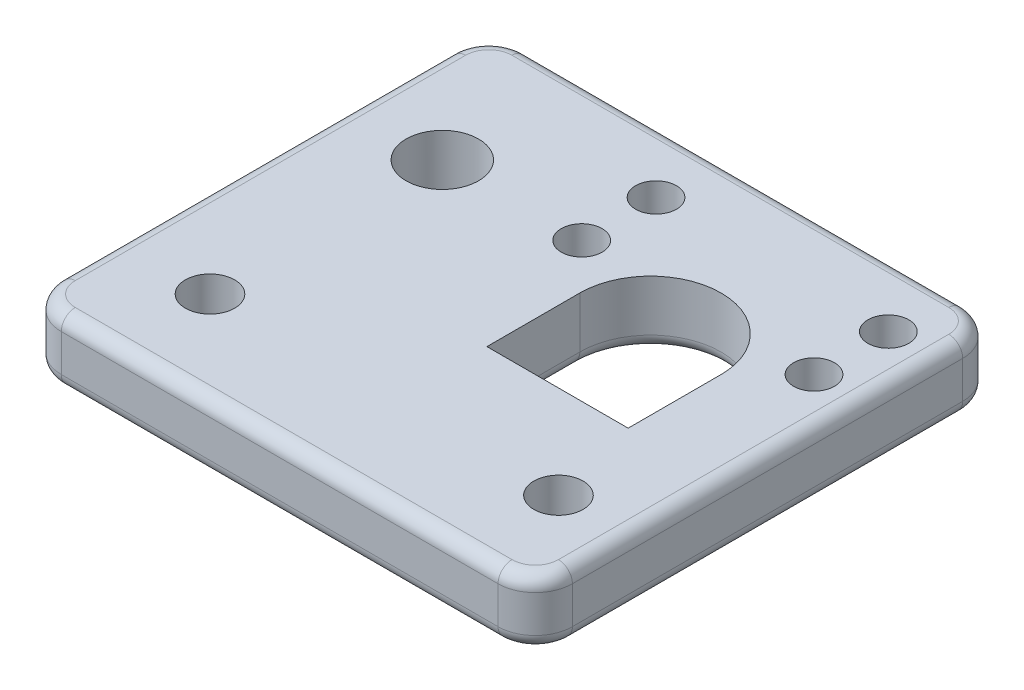
ISO-10303-21;
HEADER;
FILE_DESCRIPTION(('STEP AP214'),'2;1');
FILE_NAME('part.step','',(''),(''),'','','');
FILE_SCHEMA(('AUTOMOTIVE_DESIGN { 1 0 10303 214 1 1 1 1 }'));
ENDSEC;
DATA;
#1=APPLICATION_CONTEXT('core data for automotive mechanical design processes');
#2=APPLICATION_PROTOCOL_DEFINITION('international standard','automotive_design',2000,#1);
#3=PRODUCT_CONTEXT('',#1,'mechanical');
#4=PRODUCT('Part','Part','',(#3));
#5=PRODUCT_RELATED_PRODUCT_CATEGORY('part','',(#4));
#6=PRODUCT_DEFINITION_FORMATION('','',#4);
#7=PRODUCT_DEFINITION_CONTEXT('part definition',#1,'design');
#8=PRODUCT_DEFINITION('design','',#6,#7);
#9=PRODUCT_DEFINITION_SHAPE('','',#8);
#10=(LENGTH_UNIT() NAMED_UNIT(*) SI_UNIT(.MILLI.,.METRE.));
#11=(NAMED_UNIT(*) PLANE_ANGLE_UNIT() SI_UNIT($,.RADIAN.));
#12=(NAMED_UNIT(*) SI_UNIT($,.STERADIAN.) SOLID_ANGLE_UNIT());
#13=UNCERTAINTY_MEASURE_WITH_UNIT(LENGTH_MEASURE(1.E-05),#10,'distance_accuracy_value','');
#14=(GEOMETRIC_REPRESENTATION_CONTEXT(3) GLOBAL_UNCERTAINTY_ASSIGNED_CONTEXT((#13)) GLOBAL_UNIT_ASSIGNED_CONTEXT((#10,
#11,#12)) REPRESENTATION_CONTEXT('',''));
#15=CARTESIAN_POINT('',(0.,0.,0.));
#16=DIRECTION('',(0.,0.,1.));
#17=DIRECTION('',(1.,0.,0.));
#18=AXIS2_PLACEMENT_3D('',#15,#16,#17);
#19=CARTESIAN_POINT('',(0.,0.,0.));
#20=DIRECTION('',(0.,1.,0.));
#21=DIRECTION('',(0.,0.,1.));
#22=AXIS2_PLACEMENT_3D('',#19,#20,#21);
#23=PLANE('',#22);
#24=CARTESIAN_POINT('',(-10.,0.,-35.));
#25=DIRECTION('',(0.,1.,0.));
#26=DIRECTION('',(0.,0.,1.));
#27=AXIS2_PLACEMENT_3D('',#24,#25,#26);
#28=CIRCLE('',#27,4.90000000000002);
#29=CARTESIAN_POINT('',(-10.,0.,-30.1));
#30=VERTEX_POINT('',#29);
#31=EDGE_CURVE('E12',#30,#30,#28,.T.);
#32=ORIENTED_EDGE('',*,*,#31,.T.);
#33=EDGE_LOOP('',(#32));
#34=FACE_BOUND('',#33,.T.);
#35=DIRECTION('',(1.,0.,0.));
#36=VECTOR('',#35,1.);
#37=CARTESIAN_POINT('',(25.,0.,-18.5));
#38=LINE('',#37,#36);
#39=CARTESIAN_POINT('',(8.3,0.,-18.5));
#40=VERTEX_POINT('',#39);
#41=CARTESIAN_POINT('',(26.5,0.,-18.5));
#42=VERTEX_POINT('',#41);
#43=EDGE_CURVE('E342',#40,#42,#38,.T.);
#44=ORIENTED_EDGE('',*,*,#43,.T.);
#45=DIRECTION('',(0.,0.,-1.));
#46=VECTOR('',#45,1.);
#47=CARTESIAN_POINT('',(26.5,0.,-30.));
#48=LINE('',#47,#46);
#49=CARTESIAN_POINT('',(26.5,0.,-30.));
#50=VERTEX_POINT('',#49);
#51=EDGE_CURVE('E346',#42,#50,#48,.T.);
#52=ORIENTED_EDGE('',*,*,#51,.T.);
#53=CARTESIAN_POINT('',(17.4,0.,-30.));
#54=DIRECTION('',(0.,1.,0.));
#55=DIRECTION('',(0.,0.,1.));
#56=AXIS2_PLACEMENT_3D('',#53,#54,#55);
#57=CIRCLE('',#56,9.1);
#58=CARTESIAN_POINT('',(8.3,0.,-30.));
#59=VERTEX_POINT('',#58);
#60=EDGE_CURVE('E344',#50,#59,#57,.T.);
#61=ORIENTED_EDGE('',*,*,#60,.T.);
#62=DIRECTION('',(0.,0.,-1.));
#63=VECTOR('',#62,1.);
#64=CARTESIAN_POINT('',(8.3,0.,0.));
#65=LINE('',#64,#63);
#66=EDGE_CURVE('E340',#59,#40,#65,.F.);
#67=ORIENTED_EDGE('',*,*,#66,.T.);
#68=EDGE_LOOP('',(#44,#52,#61,#67));
#69=FACE_BOUND('',#68,.T.);
#70=DIRECTION('',(0.,0.,-1.));
#71=VECTOR('',#70,1.);
#72=CARTESIAN_POINT('',(-18.5,0.,-46.));
#73=LINE('',#72,#71);
#74=CARTESIAN_POINT('',(-18.5,0.,-4.));
#75=VERTEX_POINT('',#74);
#76=CARTESIAN_POINT('',(-18.5,0.,-46.));
#77=VERTEX_POINT('',#76);
#78=EDGE_CURVE('E335',#75,#77,#73,.T.);
#79=ORIENTED_EDGE('',*,*,#78,.T.);
#80=CARTESIAN_POINT('',(-16.,0.,-46.));
#81=DIRECTION('',(0.,1.,0.));
#82=DIRECTION('',(0.,0.,1.));
#83=AXIS2_PLACEMENT_3D('',#80,#81,#82);
#84=CIRCLE('',#83,2.5);
#85=CARTESIAN_POINT('',(-16.,0.,-48.5));
#86=VERTEX_POINT('',#85);
#87=EDGE_CURVE('E337',#77,#86,#84,.F.);
#88=ORIENTED_EDGE('',*,*,#87,.T.);
#89=DIRECTION('',(1.,0.,0.));
#90=VECTOR('',#89,1.);
#91=CARTESIAN_POINT('',(31.,0.,-48.5));
#92=LINE('',#91,#90);
#93=CARTESIAN_POINT('',(31.,0.,-48.5));
#94=VERTEX_POINT('',#93);
#95=EDGE_CURVE('E323',#86,#94,#92,.T.);
#96=ORIENTED_EDGE('',*,*,#95,.T.);
#97=CARTESIAN_POINT('',(31.,0.,-46.));
#98=DIRECTION('',(0.,1.,0.));
#99=DIRECTION('',(0.,0.,1.));
#100=AXIS2_PLACEMENT_3D('',#97,#98,#99);
#101=CIRCLE('',#100,2.5);
#102=CARTESIAN_POINT('',(33.5,0.,-46.));
#103=VERTEX_POINT('',#102);
#104=EDGE_CURVE('E325',#94,#103,#101,.F.);
#105=ORIENTED_EDGE('',*,*,#104,.T.);
#106=DIRECTION('',(0.,0.,-1.));
#107=VECTOR('',#106,1.);
#108=CARTESIAN_POINT('',(33.5,0.,0.));
#109=LINE('',#108,#107);
#110=CARTESIAN_POINT('',(33.5,0.,-4.));
#111=VERTEX_POINT('',#110);
#112=EDGE_CURVE('E327',#103,#111,#109,.F.);
#113=ORIENTED_EDGE('',*,*,#112,.T.);
#114=CARTESIAN_POINT('',(31.,0.,-4.));
#115=DIRECTION('',(0.,1.,0.));
#116=DIRECTION('',(0.,0.,1.));
#117=AXIS2_PLACEMENT_3D('',#114,#115,#116);
#118=CIRCLE('',#117,2.5);
#119=CARTESIAN_POINT('',(31.,0.,-1.5));
#120=VERTEX_POINT('',#119);
#121=EDGE_CURVE('E329',#111,#120,#118,.F.);
#122=ORIENTED_EDGE('',*,*,#121,.T.);
#123=DIRECTION('',(1.,0.,0.));
#124=VECTOR('',#123,1.);
#125=CARTESIAN_POINT('',(0.,0.,-1.5));
#126=LINE('',#125,#124);
#127=CARTESIAN_POINT('',(-16.,0.,-1.5));
#128=VERTEX_POINT('',#127);
#129=EDGE_CURVE('E331',#120,#128,#126,.F.);
#130=ORIENTED_EDGE('',*,*,#129,.T.);
#131=CARTESIAN_POINT('',(-16.,0.,-4.));
#132=DIRECTION('',(0.,1.,0.));
#133=DIRECTION('',(0.,0.,1.));
#134=AXIS2_PLACEMENT_3D('',#131,#132,#133);
#135=CIRCLE('',#134,2.5);
#136=EDGE_CURVE('E333',#128,#75,#135,.F.);
#137=ORIENTED_EDGE('',*,*,#136,.T.);
#138=EDGE_LOOP('',(#79,#88,#96,#105,#113,#122,#130,#137));
#139=FACE_BOUND('',#138,.T.);
#140=CARTESIAN_POINT('',(30.,0.,-43.));
#141=DIRECTION('',(0.,-1.,0.));
#142=DIRECTION('',(0.,0.,-1.));
#143=AXIS2_PLACEMENT_3D('',#140,#141,#142);
#144=CIRCLE('',#143,2.19999999999999);
#145=CARTESIAN_POINT('',(30.,0.,-45.2));
#146=VERTEX_POINT('',#145);
#147=EDGE_CURVE('E652',#146,#146,#144,.T.);
#148=ORIENTED_EDGE('',*,*,#147,.F.);
#149=EDGE_LOOP('',(#148));
#150=FACE_BOUND('',#149,.T.);
#151=CARTESIAN_POINT('',(30.,0.,-35.));
#152=DIRECTION('',(0.,-1.,0.));
#153=DIRECTION('',(0.,0.,-1.));
#154=AXIS2_PLACEMENT_3D('',#151,#152,#153);
#155=CIRCLE('',#154,2.2);
#156=CARTESIAN_POINT('',(30.,0.,-37.2));
#157=VERTEX_POINT('',#156);
#158=EDGE_CURVE('E656',#157,#157,#155,.T.);
#159=ORIENTED_EDGE('',*,*,#158,.F.);
#160=EDGE_LOOP('',(#159));
#161=FACE_BOUND('',#160,.T.);
#162=CARTESIAN_POINT('',(5.,0.,-43.));
#163=DIRECTION('',(0.,-1.,0.));
#164=DIRECTION('',(0.,0.,-1.));
#165=AXIS2_PLACEMENT_3D('',#162,#163,#164);
#166=CIRCLE('',#165,2.2);
#167=CARTESIAN_POINT('',(5.,0.,-45.2));
#168=VERTEX_POINT('',#167);
#169=EDGE_CURVE('E660',#168,#168,#166,.T.);
#170=ORIENTED_EDGE('',*,*,#169,.F.);
#171=EDGE_LOOP('',(#170));
#172=FACE_BOUND('',#171,.T.);
#173=CARTESIAN_POINT('',(27.5,0.,-10.));
#174=DIRECTION('',(0.,1.,0.));
#175=DIRECTION('',(0.,0.,1.));
#176=AXIS2_PLACEMENT_3D('',#173,#174,#175);
#177=CIRCLE('',#176,2.65);
#178=CARTESIAN_POINT('',(27.5,0.,-7.35));
#179=VERTEX_POINT('',#178);
#180=EDGE_CURVE('E664',#179,#179,#177,.T.);
#181=ORIENTED_EDGE('',*,*,#180,.T.);
#182=EDGE_LOOP('',(#181));
#183=FACE_BOUND('',#182,.T.);
#184=CARTESIAN_POINT('',(-10.,0.,-10.));
#185=DIRECTION('',(0.,1.,0.));
#186=DIRECTION('',(0.,0.,1.));
#187=AXIS2_PLACEMENT_3D('',#184,#185,#186);
#188=CIRCLE('',#187,2.65);
#189=CARTESIAN_POINT('',(-10.,0.,-7.35));
#190=VERTEX_POINT('',#189);
#191=EDGE_CURVE('E290',#190,#190,#188,.T.);
#192=ORIENTED_EDGE('',*,*,#191,.T.);
#193=EDGE_LOOP('',(#192));
#194=FACE_BOUND('',#193,.T.);
#195=CARTESIAN_POINT('',(5.,0.,-35.));
#196=DIRECTION('',(0.,-1.,0.));
#197=DIRECTION('',(0.,0.,-1.));
#198=AXIS2_PLACEMENT_3D('',#195,#196,#197);
#199=CIRCLE('',#198,2.2);
#200=CARTESIAN_POINT('',(5.,0.,-37.2));
#201=VERTEX_POINT('',#200);
#202=EDGE_CURVE('E670',#201,#201,#199,.T.);
#203=ORIENTED_EDGE('',*,*,#202,.F.);
#204=EDGE_LOOP('',(#203));
#205=FACE_BOUND('',#204,.T.);
#206=ADVANCED_FACE('F119',(#34,#69,#139,#150,#161,#172,#183,#194,#205),#23,.F.);
#207=CARTESIAN_POINT('',(0.,7.,0.));
#208=DIRECTION('',(0.,1.,0.));
#209=DIRECTION('',(0.,0.,1.));
#210=AXIS2_PLACEMENT_3D('',#207,#208,#209);
#211=PLANE('',#210);
#212=DIRECTION('',(1.,0.,0.));
#213=VECTOR('',#212,1.);
#214=CARTESIAN_POINT('',(0.,7.,-48.5));
#215=LINE('',#214,#213);
#216=CARTESIAN_POINT('',(31.,7.,-48.5));
#217=VERTEX_POINT('',#216);
#218=CARTESIAN_POINT('',(-16.,7.,-48.5));
#219=VERTEX_POINT('',#218);
#220=EDGE_CURVE('E352',#217,#219,#215,.F.);
#221=ORIENTED_EDGE('',*,*,#220,.T.);
#222=CARTESIAN_POINT('',(-16.,7.,-46.));
#223=DIRECTION('',(0.,1.,0.));
#224=DIRECTION('',(0.,0.,1.));
#225=AXIS2_PLACEMENT_3D('',#222,#223,#224);
#226=CIRCLE('',#225,2.5);
#227=CARTESIAN_POINT('',(-18.5,7.,-46.));
#228=VERTEX_POINT('',#227);
#229=EDGE_CURVE('E366',#219,#228,#226,.T.);
#230=ORIENTED_EDGE('',*,*,#229,.T.);
#231=DIRECTION('',(0.,0.,-1.));
#232=VECTOR('',#231,1.);
#233=CARTESIAN_POINT('',(-18.5,7.,0.));
#234=LINE('',#233,#232);
#235=CARTESIAN_POINT('',(-18.5,7.,-4.));
#236=VERTEX_POINT('',#235);
#237=EDGE_CURVE('E364',#228,#236,#234,.F.);
#238=ORIENTED_EDGE('',*,*,#237,.T.);
#239=CARTESIAN_POINT('',(-16.,7.,-4.));
#240=DIRECTION('',(0.,1.,0.));
#241=DIRECTION('',(0.,0.,1.));
#242=AXIS2_PLACEMENT_3D('',#239,#240,#241);
#243=CIRCLE('',#242,2.5);
#244=CARTESIAN_POINT('',(-16.,7.,-1.5));
#245=VERTEX_POINT('',#244);
#246=EDGE_CURVE('E362',#236,#245,#243,.T.);
#247=ORIENTED_EDGE('',*,*,#246,.T.);
#248=DIRECTION('',(1.,0.,0.));
#249=VECTOR('',#248,1.);
#250=CARTESIAN_POINT('',(31.,7.,-1.5));
#251=LINE('',#250,#249);
#252=CARTESIAN_POINT('',(31.,7.,-1.5));
#253=VERTEX_POINT('',#252);
#254=EDGE_CURVE('E360',#245,#253,#251,.T.);
#255=ORIENTED_EDGE('',*,*,#254,.T.);
#256=CARTESIAN_POINT('',(31.,7.,-4.));
#257=DIRECTION('',(0.,1.,0.));
#258=DIRECTION('',(0.,0.,1.));
#259=AXIS2_PLACEMENT_3D('',#256,#257,#258);
#260=CIRCLE('',#259,2.5);
#261=CARTESIAN_POINT('',(33.5,7.,-4.));
#262=VERTEX_POINT('',#261);
#263=EDGE_CURVE('E358',#253,#262,#260,.T.);
#264=ORIENTED_EDGE('',*,*,#263,.T.);
#265=DIRECTION('',(0.,0.,-1.));
#266=VECTOR('',#265,1.);
#267=CARTESIAN_POINT('',(33.5,7.,-46.));
#268=LINE('',#267,#266);
#269=CARTESIAN_POINT('',(33.5,7.,-46.));
#270=VERTEX_POINT('',#269);
#271=EDGE_CURVE('E356',#262,#270,#268,.T.);
#272=ORIENTED_EDGE('',*,*,#271,.T.);
#273=CARTESIAN_POINT('',(31.,7.,-46.));
#274=DIRECTION('',(0.,1.,0.));
#275=DIRECTION('',(0.,0.,1.));
#276=AXIS2_PLACEMENT_3D('',#273,#274,#275);
#277=CIRCLE('',#276,2.5);
#278=EDGE_CURVE('E354',#270,#217,#277,.T.);
#279=ORIENTED_EDGE('',*,*,#278,.T.);
#280=EDGE_LOOP('',(#221,#230,#238,#247,#255,#264,#272,#279));
#281=FACE_BOUND('',#280,.T.);
#282=CARTESIAN_POINT('',(-10.,7.,-35.));
#283=DIRECTION('',(0.,-1.,0.));
#284=DIRECTION('',(0.,0.,-1.));
#285=AXIS2_PLACEMENT_3D('',#282,#283,#284);
#286=CIRCLE('',#285,3.9);
#287=CARTESIAN_POINT('',(-10.,7.,-38.9));
#288=VERTEX_POINT('',#287);
#289=EDGE_CURVE('E416',#288,#288,#286,.T.);
#290=ORIENTED_EDGE('',*,*,#289,.T.);
#291=EDGE_LOOP('',(#290));
#292=FACE_BOUND('',#291,.T.);
#293=CARTESIAN_POINT('',(30.,7.,-43.));
#294=DIRECTION('',(0.,-1.,0.));
#295=DIRECTION('',(0.,0.,-1.));
#296=AXIS2_PLACEMENT_3D('',#293,#294,#295);
#297=CIRCLE('',#296,2.2);
#298=CARTESIAN_POINT('',(30.,7.,-45.2));
#299=VERTEX_POINT('',#298);
#300=EDGE_CURVE('E673',#299,#299,#297,.T.);
#301=ORIENTED_EDGE('',*,*,#300,.T.);
#302=EDGE_LOOP('',(#301));
#303=FACE_BOUND('',#302,.T.);
#304=CARTESIAN_POINT('',(5.,7.,-35.));
#305=DIRECTION('',(0.,-1.,0.));
#306=DIRECTION('',(0.,0.,-1.));
#307=AXIS2_PLACEMENT_3D('',#304,#305,#306);
#308=CIRCLE('',#307,2.2);
#309=CARTESIAN_POINT('',(5.,7.,-37.2));
#310=VERTEX_POINT('',#309);
#311=EDGE_CURVE('E672',#310,#310,#308,.T.);
#312=ORIENTED_EDGE('',*,*,#311,.T.);
#313=EDGE_LOOP('',(#312));
#314=FACE_BOUND('',#313,.T.);
#315=CARTESIAN_POINT('',(30.,7.,-35.));
#316=DIRECTION('',(0.,-1.,0.));
#317=DIRECTION('',(0.,0.,-1.));
#318=AXIS2_PLACEMENT_3D('',#315,#316,#317);
#319=CIRCLE('',#318,2.2);
#320=CARTESIAN_POINT('',(30.,7.,-37.2));
#321=VERTEX_POINT('',#320);
#322=EDGE_CURVE('E682',#321,#321,#319,.T.);
#323=ORIENTED_EDGE('',*,*,#322,.T.);
#324=EDGE_LOOP('',(#323));
#325=FACE_BOUND('',#324,.T.);
#326=CARTESIAN_POINT('',(17.4,7.,-30.));
#327=DIRECTION('',(0.,1.,0.));
#328=DIRECTION('',(0.,0.,1.));
#329=AXIS2_PLACEMENT_3D('',#326,#327,#328);
#330=CIRCLE('',#329,7.6);
#331=CARTESIAN_POINT('',(25.,7.,-30.));
#332=VERTEX_POINT('',#331);
#333=CARTESIAN_POINT('',(9.8,7.,-30.));
#334=VERTEX_POINT('',#333);
#335=EDGE_CURVE('E295',#332,#334,#330,.T.);
#336=ORIENTED_EDGE('',*,*,#335,.F.);
#337=DIRECTION('',(0.,0.,1.));
#338=VECTOR('',#337,1.);
#339=CARTESIAN_POINT('',(25.,7.,0.));
#340=LINE('',#339,#338);
#341=CARTESIAN_POINT('',(25.,7.,-20.));
#342=VERTEX_POINT('',#341);
#343=EDGE_CURVE('E286',#332,#342,#340,.T.);
#344=ORIENTED_EDGE('',*,*,#343,.T.);
#345=DIRECTION('',(-1.,0.,0.));
#346=VECTOR('',#345,1.);
#347=CARTESIAN_POINT('',(0.,7.,-20.));
#348=LINE('',#347,#346);
#349=CARTESIAN_POINT('',(9.8,7.,-20.));
#350=VERTEX_POINT('',#349);
#351=EDGE_CURVE('E270',#342,#350,#348,.T.);
#352=ORIENTED_EDGE('',*,*,#351,.T.);
#353=DIRECTION('',(0.,0.,1.));
#354=VECTOR('',#353,1.);
#355=CARTESIAN_POINT('',(9.8,7.,0.));
#356=LINE('',#355,#354);
#357=EDGE_CURVE('E279',#334,#350,#356,.T.);
#358=ORIENTED_EDGE('',*,*,#357,.F.);
#359=EDGE_LOOP('',(#336,#344,#352,#358));
#360=FACE_BOUND('',#359,.T.);
#361=CARTESIAN_POINT('',(-10.,7.,-10.));
#362=DIRECTION('',(0.,1.,0.));
#363=DIRECTION('',(0.,0.,1.));
#364=AXIS2_PLACEMENT_3D('',#361,#362,#363);
#365=CIRCLE('',#364,2.65);
#366=CARTESIAN_POINT('',(-10.,7.,-7.35));
#367=VERTEX_POINT('',#366);
#368=EDGE_CURVE('E693',#367,#367,#365,.T.);
#369=ORIENTED_EDGE('',*,*,#368,.F.);
#370=EDGE_LOOP('',(#369));
#371=FACE_BOUND('',#370,.T.);
#372=CARTESIAN_POINT('',(27.5,7.,-10.));
#373=DIRECTION('',(0.,1.,0.));
#374=DIRECTION('',(0.,0.,1.));
#375=AXIS2_PLACEMENT_3D('',#372,#373,#374);
#376=CIRCLE('',#375,2.65);
#377=CARTESIAN_POINT('',(27.5,7.,-7.35));
#378=VERTEX_POINT('',#377);
#379=EDGE_CURVE('E689',#378,#378,#376,.T.);
#380=ORIENTED_EDGE('',*,*,#379,.F.);
#381=EDGE_LOOP('',(#380));
#382=FACE_BOUND('',#381,.T.);
#383=CARTESIAN_POINT('',(5.,7.,-43.));
#384=DIRECTION('',(0.,-1.,0.));
#385=DIRECTION('',(0.,0.,-1.));
#386=AXIS2_PLACEMENT_3D('',#383,#384,#385);
#387=CIRCLE('',#386,2.2);
#388=CARTESIAN_POINT('',(5.,7.,-45.2));
#389=VERTEX_POINT('',#388);
#390=EDGE_CURVE('E686',#389,#389,#387,.T.);
#391=ORIENTED_EDGE('',*,*,#390,.T.);
#392=EDGE_LOOP('',(#391));
#393=FACE_BOUND('',#392,.T.);
#394=ADVANCED_FACE('F293',(#281,#292,#303,#314,#325,#360,#371,#382,#393),#211,.T.);
#395=CARTESIAN_POINT('',(0.,7.,0.));
#396=DIRECTION('',(0.,0.,-1.));
#397=DIRECTION('',(-1.,0.,0.));
#398=AXIS2_PLACEMENT_3D('',#395,#396,#397);
#399=PLANE('',#398);
#400=DIRECTION('',(0.,-1.,0.));
#401=VECTOR('',#400,1.);
#402=CARTESIAN_POINT('',(31.,7.,0.));
#403=LINE('',#402,#401);
#404=CARTESIAN_POINT('',(31.,1.5,0.));
#405=VERTEX_POINT('',#404);
#406=CARTESIAN_POINT('',(31.,5.5,0.));
#407=VERTEX_POINT('',#406);
#408=EDGE_CURVE('E296',#405,#407,#403,.F.);
#409=ORIENTED_EDGE('',*,*,#408,.T.);
#410=DIRECTION('',(1.,0.,0.));
#411=VECTOR('',#410,1.);
#412=CARTESIAN_POINT('',(-16.,5.5,0.));
#413=LINE('',#412,#411);
#414=CARTESIAN_POINT('',(-16.,5.5,0.));
#415=VERTEX_POINT('',#414);
#416=EDGE_CURVE('E385',#407,#415,#413,.F.);
#417=ORIENTED_EDGE('',*,*,#416,.T.);
#418=DIRECTION('',(0.,-1.,0.));
#419=VECTOR('',#418,1.);
#420=CARTESIAN_POINT('',(-16.,0.,0.));
#421=LINE('',#420,#419);
#422=CARTESIAN_POINT('',(-16.,1.5,0.));
#423=VERTEX_POINT('',#422);
#424=EDGE_CURVE('E299',#415,#423,#421,.T.);
#425=ORIENTED_EDGE('',*,*,#424,.T.);
#426=DIRECTION('',(1.,0.,0.));
#427=VECTOR('',#426,1.);
#428=CARTESIAN_POINT('',(0.,1.5,0.));
#429=LINE('',#428,#427);
#430=EDGE_CURVE('E383',#423,#405,#429,.T.);
#431=ORIENTED_EDGE('',*,*,#430,.T.);
#432=EDGE_LOOP('',(#409,#417,#425,#431));
#433=FACE_BOUND('',#432,.T.);
#434=ADVANCED_FACE('F482',(#433),#399,.F.);
#435=CARTESIAN_POINT('',(35.,7.,0.));
#436=DIRECTION('',(-1.,0.,0.));
#437=DIRECTION('',(0.,0.,1.));
#438=AXIS2_PLACEMENT_3D('',#435,#436,#437);
#439=PLANE('',#438);
#440=DIRECTION('',(0.,-1.,0.));
#441=VECTOR('',#440,1.);
#442=CARTESIAN_POINT('',(35.,7.,-46.));
#443=LINE('',#442,#441);
#444=CARTESIAN_POINT('',(35.,1.5,-46.));
#445=VERTEX_POINT('',#444);
#446=CARTESIAN_POINT('',(35.,5.5,-46.));
#447=VERTEX_POINT('',#446);
#448=EDGE_CURVE('E320',#445,#447,#443,.F.);
#449=ORIENTED_EDGE('',*,*,#448,.T.);
#450=DIRECTION('',(0.,0.,-1.));
#451=VECTOR('',#450,1.);
#452=CARTESIAN_POINT('',(35.,5.5,-4.));
#453=LINE('',#452,#451);
#454=CARTESIAN_POINT('',(35.,5.5,-4.));
#455=VERTEX_POINT('',#454);
#456=EDGE_CURVE('E393',#447,#455,#453,.F.);
#457=ORIENTED_EDGE('',*,*,#456,.T.);
#458=DIRECTION('',(0.,-1.,0.));
#459=VECTOR('',#458,1.);
#460=CARTESIAN_POINT('',(35.,7.,-4.));
#461=LINE('',#460,#459);
#462=CARTESIAN_POINT('',(35.,1.5,-4.));
#463=VERTEX_POINT('',#462);
#464=EDGE_CURVE('E317',#455,#463,#461,.T.);
#465=ORIENTED_EDGE('',*,*,#464,.T.);
#466=DIRECTION('',(0.,0.,-1.));
#467=VECTOR('',#466,1.);
#468=CARTESIAN_POINT('',(35.,1.5,0.));
#469=LINE('',#468,#467);
#470=EDGE_CURVE('E391',#463,#445,#469,.T.);
#471=ORIENTED_EDGE('',*,*,#470,.T.);
#472=EDGE_LOOP('',(#449,#457,#465,#471));
#473=FACE_BOUND('',#472,.T.);
#474=ADVANCED_FACE('F492',(#473),#439,.F.);
#475=CARTESIAN_POINT('',(0.,7.,-50.));
#476=DIRECTION('',(0.,0.,-1.));
#477=DIRECTION('',(-1.,0.,0.));
#478=AXIS2_PLACEMENT_3D('',#475,#476,#477);
#479=PLANE('',#478);
#480=DIRECTION('',(0.,-1.,0.));
#481=VECTOR('',#480,1.);
#482=CARTESIAN_POINT('',(-16.,7.,-50.));
#483=LINE('',#482,#481);
#484=CARTESIAN_POINT('',(-16.,1.5,-50.));
#485=VERTEX_POINT('',#484);
#486=CARTESIAN_POINT('',(-16.,5.5,-50.));
#487=VERTEX_POINT('',#486);
#488=EDGE_CURVE('E314',#485,#487,#483,.F.);
#489=ORIENTED_EDGE('',*,*,#488,.T.);
#490=DIRECTION('',(1.,0.,0.));
#491=VECTOR('',#490,1.);
#492=CARTESIAN_POINT('',(0.,5.5,-50.));
#493=LINE('',#492,#491);
#494=CARTESIAN_POINT('',(31.,5.5,-50.));
#495=VERTEX_POINT('',#494);
#496=EDGE_CURVE('E403',#487,#495,#493,.T.);
#497=ORIENTED_EDGE('',*,*,#496,.T.);
#498=DIRECTION('',(0.,-1.,0.));
#499=VECTOR('',#498,1.);
#500=CARTESIAN_POINT('',(31.,0.,-50.));
#501=LINE('',#500,#499);
#502=CARTESIAN_POINT('',(31.,1.5,-50.));
#503=VERTEX_POINT('',#502);
#504=EDGE_CURVE('E312',#495,#503,#501,.T.);
#505=ORIENTED_EDGE('',*,*,#504,.T.);
#506=DIRECTION('',(1.,0.,0.));
#507=VECTOR('',#506,1.);
#508=CARTESIAN_POINT('',(-16.,1.5,-50.));
#509=LINE('',#508,#507);
#510=EDGE_CURVE('E401',#503,#485,#509,.F.);
#511=ORIENTED_EDGE('',*,*,#510,.T.);
#512=EDGE_LOOP('',(#489,#497,#505,#511));
#513=FACE_BOUND('',#512,.T.);
#514=ADVANCED_FACE('F488',(#513),#479,.T.);
#515=CARTESIAN_POINT('',(-20.,7.,0.));
#516=DIRECTION('',(-1.,0.,0.));
#517=DIRECTION('',(0.,0.,1.));
#518=AXIS2_PLACEMENT_3D('',#515,#516,#517);
#519=PLANE('',#518);
#520=DIRECTION('',(0.,-1.,0.));
#521=VECTOR('',#520,1.);
#522=CARTESIAN_POINT('',(-20.,7.,-4.));
#523=LINE('',#522,#521);
#524=CARTESIAN_POINT('',(-20.,1.5,-4.));
#525=VERTEX_POINT('',#524);
#526=CARTESIAN_POINT('',(-20.,5.5,-4.));
#527=VERTEX_POINT('',#526);
#528=EDGE_CURVE('E309',#525,#527,#523,.F.);
#529=ORIENTED_EDGE('',*,*,#528,.T.);
#530=DIRECTION('',(0.,0.,-1.));
#531=VECTOR('',#530,1.);
#532=CARTESIAN_POINT('',(-20.,5.5,0.));
#533=LINE('',#532,#531);
#534=CARTESIAN_POINT('',(-20.,5.5,-46.));
#535=VERTEX_POINT('',#534);
#536=EDGE_CURVE('E377',#527,#535,#533,.T.);
#537=ORIENTED_EDGE('',*,*,#536,.T.);
#538=DIRECTION('',(0.,-1.,0.));
#539=VECTOR('',#538,1.);
#540=CARTESIAN_POINT('',(-20.,7.,-46.));
#541=LINE('',#540,#539);
#542=CARTESIAN_POINT('',(-20.,1.5,-46.));
#543=VERTEX_POINT('',#542);
#544=EDGE_CURVE('E306',#535,#543,#541,.T.);
#545=ORIENTED_EDGE('',*,*,#544,.T.);
#546=DIRECTION('',(0.,0.,-1.));
#547=VECTOR('',#546,1.);
#548=CARTESIAN_POINT('',(-20.,1.5,-4.));
#549=LINE('',#548,#547);
#550=EDGE_CURVE('E375',#543,#525,#549,.F.);
#551=ORIENTED_EDGE('',*,*,#550,.T.);
#552=EDGE_LOOP('',(#529,#537,#545,#551));
#553=FACE_BOUND('',#552,.T.);
#554=ADVANCED_FACE('F491',(#553),#519,.T.);
#555=CARTESIAN_POINT('',(25.,10.,0.));
#556=DIRECTION('',(-1.,0.,0.));
#557=DIRECTION('',(0.,0.,1.));
#558=AXIS2_PLACEMENT_3D('',#555,#556,#557);
#559=PLANE('',#558);
#560=DIRECTION('',(0.,-1.,0.));
#561=VECTOR('',#560,1.);
#562=CARTESIAN_POINT('',(25.,10.,-30.));
#563=LINE('',#562,#561);
#564=CARTESIAN_POINT('',(25.,1.5,-30.));
#565=VERTEX_POINT('',#564);
#566=EDGE_CURVE('E280',#332,#565,#563,.T.);
#567=ORIENTED_EDGE('',*,*,#566,.T.);
#568=DIRECTION('',(0.,0.,-1.));
#569=VECTOR('',#568,1.);
#570=CARTESIAN_POINT('',(25.,1.5,-20.));
#571=LINE('',#570,#569);
#572=CARTESIAN_POINT('',(25.,1.5,-20.));
#573=VERTEX_POINT('',#572);
#574=EDGE_CURVE('E289',#565,#573,#571,.F.);
#575=ORIENTED_EDGE('',*,*,#574,.T.);
#576=DIRECTION('',(0.,-1.,0.));
#577=VECTOR('',#576,1.);
#578=CARTESIAN_POINT('',(25.,10.,-20.));
#579=LINE('',#578,#577);
#580=EDGE_CURVE('E273',#342,#573,#579,.T.);
#581=ORIENTED_EDGE('',*,*,#580,.F.);
#582=ORIENTED_EDGE('',*,*,#343,.F.);
#583=EDGE_LOOP('',(#567,#575,#581,#582));
#584=FACE_BOUND('',#583,.T.);
#585=ADVANCED_FACE('F285',(#584),#559,.T.);
#586=CARTESIAN_POINT('',(17.4,10.,-30.));
#587=DIRECTION('',(0.,-1.,0.));
#588=DIRECTION('',(0.,0.,-1.));
#589=AXIS2_PLACEMENT_3D('',#586,#587,#588);
#590=CYLINDRICAL_SURFACE('',#589,7.6);
#591=DIRECTION('',(0.,-1.,0.));
#592=VECTOR('',#591,1.);
#593=CARTESIAN_POINT('',(9.8,10.,-30.));
#594=LINE('',#593,#592);
#595=CARTESIAN_POINT('',(9.8,1.5,-30.));
#596=VERTEX_POINT('',#595);
#597=EDGE_CURVE('E698',#334,#596,#594,.T.);
#598=ORIENTED_EDGE('',*,*,#597,.T.);
#599=CARTESIAN_POINT('',(17.4,1.5,-30.));
#600=DIRECTION('',(0.,1.,0.));
#601=DIRECTION('',(0.,0.,1.));
#602=AXIS2_PLACEMENT_3D('',#599,#600,#601);
#603=CIRCLE('',#602,7.6);
#604=EDGE_CURVE('E350',#596,#565,#603,.F.);
#605=ORIENTED_EDGE('',*,*,#604,.T.);
#606=ORIENTED_EDGE('',*,*,#566,.F.);
#607=ORIENTED_EDGE('',*,*,#335,.T.);
#608=EDGE_LOOP('',(#598,#605,#606,#607));
#609=FACE_BOUND('',#608,.T.);
#610=ADVANCED_FACE('F707',(#609),#590,.F.);
#611=CARTESIAN_POINT('',(9.8,10.,0.));
#612=DIRECTION('',(-1.,0.,0.));
#613=DIRECTION('',(0.,0.,1.));
#614=AXIS2_PLACEMENT_3D('',#611,#612,#613);
#615=PLANE('',#614);
#616=DIRECTION('',(0.,-1.,0.));
#617=VECTOR('',#616,1.);
#618=CARTESIAN_POINT('',(9.8,10.,-20.));
#619=LINE('',#618,#617);
#620=CARTESIAN_POINT('',(9.8,1.5,-20.));
#621=VERTEX_POINT('',#620);
#622=EDGE_CURVE('E274',#350,#621,#619,.T.);
#623=ORIENTED_EDGE('',*,*,#622,.T.);
#624=DIRECTION('',(0.,0.,-1.));
#625=VECTOR('',#624,1.);
#626=CARTESIAN_POINT('',(9.8,1.5,0.));
#627=LINE('',#626,#625);
#628=EDGE_CURVE('E399',#621,#596,#627,.T.);
#629=ORIENTED_EDGE('',*,*,#628,.T.);
#630=ORIENTED_EDGE('',*,*,#597,.F.);
#631=ORIENTED_EDGE('',*,*,#357,.T.);
#632=EDGE_LOOP('',(#623,#629,#630,#631));
#633=FACE_BOUND('',#632,.T.);
#634=ADVANCED_FACE('F703',(#633),#615,.F.);
#635=CARTESIAN_POINT('',(0.,10.,-20.));
#636=DIRECTION('',(0.,0.,-1.));
#637=DIRECTION('',(-1.,0.,0.));
#638=AXIS2_PLACEMENT_3D('',#635,#636,#637);
#639=PLANE('',#638);
#640=ORIENTED_EDGE('',*,*,#580,.T.);
#641=DIRECTION('',(1.,0.,0.));
#642=VECTOR('',#641,1.);
#643=CARTESIAN_POINT('',(9.8,1.5,-20.));
#644=LINE('',#643,#642);
#645=EDGE_CURVE('E135',#573,#621,#644,.F.);
#646=ORIENTED_EDGE('',*,*,#645,.T.);
#647=ORIENTED_EDGE('',*,*,#622,.F.);
#648=ORIENTED_EDGE('',*,*,#351,.F.);
#649=EDGE_LOOP('',(#640,#646,#647,#648));
#650=FACE_BOUND('',#649,.T.);
#651=ADVANCED_FACE('F272',(#650),#639,.T.);
#652=CARTESIAN_POINT('',(-10.,7.,-10.));
#653=DIRECTION('',(0.,1.,0.));
#654=DIRECTION('',(0.,0.,1.));
#655=AXIS2_PLACEMENT_3D('',#652,#653,#654);
#656=CYLINDRICAL_SURFACE('',#655,2.65);
#657=ORIENTED_EDGE('',*,*,#191,.F.);
#658=EDGE_LOOP('',(#657));
#659=FACE_BOUND('',#658,.T.);
#660=ORIENTED_EDGE('',*,*,#368,.T.);
#661=EDGE_LOOP('',(#660));
#662=FACE_BOUND('',#661,.T.);
#663=ADVANCED_FACE('F724',(#659,#662),#656,.F.);
#664=CARTESIAN_POINT('',(27.5,7.,-10.));
#665=DIRECTION('',(0.,1.,0.));
#666=DIRECTION('',(0.,0.,1.));
#667=AXIS2_PLACEMENT_3D('',#664,#665,#666);
#668=CYLINDRICAL_SURFACE('',#667,2.65);
#669=ORIENTED_EDGE('',*,*,#180,.F.);
#670=EDGE_LOOP('',(#669));
#671=FACE_BOUND('',#670,.T.);
#672=ORIENTED_EDGE('',*,*,#379,.T.);
#673=EDGE_LOOP('',(#672));
#674=FACE_BOUND('',#673,.T.);
#675=ADVANCED_FACE('F731',(#671,#674),#668,.F.);
#676=CARTESIAN_POINT('',(5.,0.,-43.));
#677=DIRECTION('',(0.,-1.,0.));
#678=DIRECTION('',(0.,0.,-1.));
#679=AXIS2_PLACEMENT_3D('',#676,#677,#678);
#680=CYLINDRICAL_SURFACE('',#679,2.2);
#681=ORIENTED_EDGE('',*,*,#390,.F.);
#682=EDGE_LOOP('',(#681));
#683=FACE_BOUND('',#682,.T.);
#684=ORIENTED_EDGE('',*,*,#169,.T.);
#685=EDGE_LOOP('',(#684));
#686=FACE_BOUND('',#685,.T.);
#687=ADVANCED_FACE('F736',(#683,#686),#680,.F.);
#688=CARTESIAN_POINT('',(30.,0.,-35.));
#689=DIRECTION('',(0.,-1.,0.));
#690=DIRECTION('',(0.,0.,-1.));
#691=AXIS2_PLACEMENT_3D('',#688,#689,#690);
#692=CYLINDRICAL_SURFACE('',#691,2.2);
#693=ORIENTED_EDGE('',*,*,#322,.F.);
#694=EDGE_LOOP('',(#693));
#695=FACE_BOUND('',#694,.T.);
#696=ORIENTED_EDGE('',*,*,#158,.T.);
#697=EDGE_LOOP('',(#696));
#698=FACE_BOUND('',#697,.T.);
#699=ADVANCED_FACE('F747',(#695,#698),#692,.F.);
#700=CARTESIAN_POINT('',(5.,0.,-35.));
#701=DIRECTION('',(0.,-1.,0.));
#702=DIRECTION('',(0.,0.,-1.));
#703=AXIS2_PLACEMENT_3D('',#700,#701,#702);
#704=CYLINDRICAL_SURFACE('',#703,2.2);
#705=ORIENTED_EDGE('',*,*,#311,.F.);
#706=EDGE_LOOP('',(#705));
#707=FACE_BOUND('',#706,.T.);
#708=ORIENTED_EDGE('',*,*,#202,.T.);
#709=EDGE_LOOP('',(#708));
#710=FACE_BOUND('',#709,.T.);
#711=ADVANCED_FACE('F752',(#707,#710),#704,.F.);
#712=CARTESIAN_POINT('',(30.,0.,-43.));
#713=DIRECTION('',(0.,-1.,0.));
#714=DIRECTION('',(0.,0.,-1.));
#715=AXIS2_PLACEMENT_3D('',#712,#713,#714);
#716=CYLINDRICAL_SURFACE('',#715,2.2);
#717=ORIENTED_EDGE('',*,*,#300,.F.);
#718=EDGE_LOOP('',(#717));
#719=FACE_BOUND('',#718,.T.);
#720=ORIENTED_EDGE('',*,*,#147,.T.);
#721=EDGE_LOOP('',(#720));
#722=FACE_BOUND('',#721,.T.);
#723=ADVANCED_FACE('F758',(#719,#722),#716,.F.);
#724=CARTESIAN_POINT('',(-10.,0.,-35.));
#725=DIRECTION('',(0.,-1.,0.));
#726=DIRECTION('',(0.,0.,-1.));
#727=AXIS2_PLACEMENT_3D('',#724,#725,#726);
#728=CYLINDRICAL_SURFACE('',#727,3.9);
#729=CARTESIAN_POINT('',(-10.,1.00000000000001,-35.));
#730=DIRECTION('',(0.,1.,0.));
#731=DIRECTION('',(0.,0.,1.));
#732=AXIS2_PLACEMENT_3D('',#729,#730,#731);
#733=CIRCLE('',#732,3.9);
#734=CARTESIAN_POINT('',(-10.,1.00000000000001,-31.1));
#735=VERTEX_POINT('',#734);
#736=EDGE_CURVE('E128',#735,#735,#733,.F.);
#737=ORIENTED_EDGE('',*,*,#736,.T.);
#738=EDGE_LOOP('',(#737));
#739=FACE_BOUND('',#738,.T.);
#740=ORIENTED_EDGE('',*,*,#289,.F.);
#741=EDGE_LOOP('',(#740));
#742=FACE_BOUND('',#741,.T.);
#743=ADVANCED_FACE('F462',(#739,#742),#728,.F.);
#744=CARTESIAN_POINT('',(-16.,7.,-4.));
#745=DIRECTION('',(0.,1.,0.));
#746=DIRECTION('',(0.,0.,1.));
#747=AXIS2_PLACEMENT_3D('',#744,#745,#746);
#748=CYLINDRICAL_SURFACE('',#747,4.);
#749=ORIENTED_EDGE('',*,*,#424,.F.);
#750=CARTESIAN_POINT('',(-16.,5.5,-4.));
#751=DIRECTION('',(0.,1.,0.));
#752=DIRECTION('',(0.,0.,1.));
#753=AXIS2_PLACEMENT_3D('',#750,#751,#752);
#754=CIRCLE('',#753,4.);
#755=EDGE_CURVE('E381',#415,#527,#754,.F.);
#756=ORIENTED_EDGE('',*,*,#755,.T.);
#757=ORIENTED_EDGE('',*,*,#528,.F.);
#758=CARTESIAN_POINT('',(-16.,1.5,-4.));
#759=DIRECTION('',(0.,1.,0.));
#760=DIRECTION('',(0.,0.,1.));
#761=AXIS2_PLACEMENT_3D('',#758,#759,#760);
#762=CIRCLE('',#761,4.);
#763=EDGE_CURVE('E379',#525,#423,#762,.T.);
#764=ORIENTED_EDGE('',*,*,#763,.T.);
#765=EDGE_LOOP('',(#749,#756,#757,#764));
#766=FACE_BOUND('',#765,.T.);
#767=ADVANCED_FACE('F503',(#766),#748,.T.);
#768=CARTESIAN_POINT('',(-16.,7.,-46.));
#769=DIRECTION('',(0.,-1.,0.));
#770=DIRECTION('',(0.,0.,-1.));
#771=AXIS2_PLACEMENT_3D('',#768,#769,#770);
#772=CYLINDRICAL_SURFACE('',#771,4.);
#773=ORIENTED_EDGE('',*,*,#544,.F.);
#774=CARTESIAN_POINT('',(-16.,5.5,-46.));
#775=DIRECTION('',(0.,1.,0.));
#776=DIRECTION('',(0.,0.,1.));
#777=AXIS2_PLACEMENT_3D('',#774,#775,#776);
#778=CIRCLE('',#777,4.);
#779=EDGE_CURVE('E372',#535,#487,#778,.F.);
#780=ORIENTED_EDGE('',*,*,#779,.T.);
#781=ORIENTED_EDGE('',*,*,#488,.F.);
#782=CARTESIAN_POINT('',(-16.,1.5,-46.));
#783=DIRECTION('',(0.,1.,0.));
#784=DIRECTION('',(0.,0.,1.));
#785=AXIS2_PLACEMENT_3D('',#782,#783,#784);
#786=CIRCLE('',#785,4.);
#787=EDGE_CURVE('E369',#485,#543,#786,.T.);
#788=ORIENTED_EDGE('',*,*,#787,.T.);
#789=EDGE_LOOP('',(#773,#780,#781,#788));
#790=FACE_BOUND('',#789,.T.);
#791=ADVANCED_FACE('F506',(#790),#772,.T.);
#792=CARTESIAN_POINT('',(31.,7.,-46.));
#793=DIRECTION('',(0.,1.,0.));
#794=DIRECTION('',(0.,0.,1.));
#795=AXIS2_PLACEMENT_3D('',#792,#793,#794);
#796=CYLINDRICAL_SURFACE('',#795,4.);
#797=ORIENTED_EDGE('',*,*,#504,.F.);
#798=CARTESIAN_POINT('',(31.,5.5,-46.));
#799=DIRECTION('',(0.,1.,0.));
#800=DIRECTION('',(0.,0.,1.));
#801=AXIS2_PLACEMENT_3D('',#798,#799,#800);
#802=CIRCLE('',#801,4.);
#803=EDGE_CURVE('E396',#495,#447,#802,.F.);
#804=ORIENTED_EDGE('',*,*,#803,.T.);
#805=ORIENTED_EDGE('',*,*,#448,.F.);
#806=CARTESIAN_POINT('',(31.,1.5,-46.));
#807=DIRECTION('',(0.,1.,0.));
#808=DIRECTION('',(0.,0.,1.));
#809=AXIS2_PLACEMENT_3D('',#806,#807,#808);
#810=CIRCLE('',#809,4.);
#811=EDGE_CURVE('E143',#445,#503,#810,.T.);
#812=ORIENTED_EDGE('',*,*,#811,.T.);
#813=EDGE_LOOP('',(#797,#804,#805,#812));
#814=FACE_BOUND('',#813,.T.);
#815=ADVANCED_FACE('F510',(#814),#796,.T.);
#816=CARTESIAN_POINT('',(31.,7.,-4.));
#817=DIRECTION('',(0.,-1.,0.));
#818=DIRECTION('',(0.,0.,-1.));
#819=AXIS2_PLACEMENT_3D('',#816,#817,#818);
#820=CYLINDRICAL_SURFACE('',#819,4.);
#821=ORIENTED_EDGE('',*,*,#464,.F.);
#822=CARTESIAN_POINT('',(31.,5.5,-4.));
#823=DIRECTION('',(0.,1.,0.));
#824=DIRECTION('',(0.,0.,1.));
#825=AXIS2_PLACEMENT_3D('',#822,#823,#824);
#826=CIRCLE('',#825,4.);
#827=EDGE_CURVE('E389',#455,#407,#826,.F.);
#828=ORIENTED_EDGE('',*,*,#827,.T.);
#829=ORIENTED_EDGE('',*,*,#408,.F.);
#830=CARTESIAN_POINT('',(31.,1.5,-4.));
#831=DIRECTION('',(0.,1.,0.));
#832=DIRECTION('',(0.,0.,1.));
#833=AXIS2_PLACEMENT_3D('',#830,#831,#832);
#834=CIRCLE('',#833,4.);
#835=EDGE_CURVE('E387',#405,#463,#834,.T.);
#836=ORIENTED_EDGE('',*,*,#835,.T.);
#837=EDGE_LOOP('',(#821,#828,#829,#836));
#838=FACE_BOUND('',#837,.T.);
#839=ADVANCED_FACE('F514',(#838),#820,.T.);
#840=CARTESIAN_POINT('',(8.3,1.5,0.));
#841=DIRECTION('',(0.,0.,-1.));
#842=DIRECTION('',(-1.,0.,0.));
#843=AXIS2_PLACEMENT_3D('',#840,#841,#842);
#844=CYLINDRICAL_SURFACE('',#843,1.5);
#845=CARTESIAN_POINT('',(8.3,1.5,-30.));
#846=DIRECTION('',(0.,0.,-1.));
#847=DIRECTION('',(-1.,0.,0.));
#848=AXIS2_PLACEMENT_3D('',#845,#846,#847);
#849=CIRCLE('',#848,1.5);
#850=EDGE_CURVE('E410',#596,#59,#849,.T.);
#851=ORIENTED_EDGE('',*,*,#850,.F.);
#852=ORIENTED_EDGE('',*,*,#628,.F.);
#853=CARTESIAN_POINT('',(8.3,1.5,-18.5));
#854=DIRECTION('',(-0.707106781186547,0.,-0.707106781186547));
#855=DIRECTION('',(-0.707106781186547,0.,0.707106781186547));
#856=AXIS2_PLACEMENT_3D('',#853,#854,#855);
#857=ELLIPSE('',#856,2.12132034355964,1.5);
#858=EDGE_CURVE('E413',#40,#621,#857,.F.);
#859=ORIENTED_EDGE('',*,*,#858,.F.);
#860=ORIENTED_EDGE('',*,*,#66,.F.);
#861=EDGE_LOOP('',(#851,#852,#859,#860));
#862=FACE_BOUND('',#861,.T.);
#863=ADVANCED_FACE('F517',(#862),#844,.T.);
#864=CARTESIAN_POINT('',(0.,1.5,-18.5));
#865=DIRECTION('',(-1.,0.,0.));
#866=DIRECTION('',(0.,0.,1.));
#867=AXIS2_PLACEMENT_3D('',#864,#865,#866);
#868=CYLINDRICAL_SURFACE('',#867,1.5);
#869=ORIENTED_EDGE('',*,*,#858,.T.);
#870=ORIENTED_EDGE('',*,*,#645,.F.);
#871=CARTESIAN_POINT('',(26.5,1.5,-18.5));
#872=DIRECTION('',(-0.707106781186548,0.,0.707106781186547));
#873=DIRECTION('',(0.707106781186547,0.,0.707106781186548));
#874=AXIS2_PLACEMENT_3D('',#871,#872,#873);
#875=ELLIPSE('',#874,2.12132034355964,1.5);
#876=EDGE_CURVE('E407',#42,#573,#875,.F.);
#877=ORIENTED_EDGE('',*,*,#876,.F.);
#878=ORIENTED_EDGE('',*,*,#43,.F.);
#879=EDGE_LOOP('',(#869,#870,#877,#878));
#880=FACE_BOUND('',#879,.T.);
#881=ADVANCED_FACE('F527',(#880),#868,.T.);
#882=CARTESIAN_POINT('',(17.4,1.5,-30.));
#883=DIRECTION('',(0.,1.,0.));
#884=DIRECTION('',(0.,0.,1.));
#885=AXIS2_PLACEMENT_3D('',#882,#883,#884);
#886=TOROIDAL_SURFACE('',#885,9.1,1.5);
#887=ORIENTED_EDGE('',*,*,#850,.T.);
#888=ORIENTED_EDGE('',*,*,#60,.F.);
#889=CARTESIAN_POINT('',(26.5,1.5,-30.));
#890=DIRECTION('',(0.,0.,1.));
#891=DIRECTION('',(1.,0.,0.));
#892=AXIS2_PLACEMENT_3D('',#889,#890,#891);
#893=CIRCLE('',#892,1.5);
#894=EDGE_CURVE('E405',#565,#50,#893,.T.);
#895=ORIENTED_EDGE('',*,*,#894,.F.);
#896=ORIENTED_EDGE('',*,*,#604,.F.);
#897=EDGE_LOOP('',(#887,#888,#895,#896));
#898=FACE_BOUND('',#897,.T.);
#899=ADVANCED_FACE('F523',(#898),#886,.T.);
#900=CARTESIAN_POINT('',(26.5,1.5,0.));
#901=DIRECTION('',(0.,0.,1.));
#902=DIRECTION('',(1.,0.,0.));
#903=AXIS2_PLACEMENT_3D('',#900,#901,#902);
#904=CYLINDRICAL_SURFACE('',#903,1.5);
#905=ORIENTED_EDGE('',*,*,#876,.T.);
#906=ORIENTED_EDGE('',*,*,#574,.F.);
#907=ORIENTED_EDGE('',*,*,#894,.T.);
#908=ORIENTED_EDGE('',*,*,#51,.F.);
#909=EDGE_LOOP('',(#905,#906,#907,#908));
#910=FACE_BOUND('',#909,.T.);
#911=ADVANCED_FACE('F519',(#910),#904,.T.);
#912=CARTESIAN_POINT('',(31.,5.5,-4.));
#913=DIRECTION('',(0.,1.,0.));
#914=DIRECTION('',(0.,0.,1.));
#915=AXIS2_PLACEMENT_3D('',#912,#913,#914);
#916=TOROIDAL_SURFACE('',#915,2.5,1.5);
#917=CARTESIAN_POINT('',(31.,5.5,-1.5));
#918=DIRECTION('',(-1.,0.,0.));
#919=DIRECTION('',(0.,0.,1.));
#920=AXIS2_PLACEMENT_3D('',#917,#918,#919);
#921=CIRCLE('',#920,1.5);
#922=EDGE_CURVE('E434',#407,#253,#921,.T.);
#923=ORIENTED_EDGE('',*,*,#922,.F.);
#924=ORIENTED_EDGE('',*,*,#827,.F.);
#925=CARTESIAN_POINT('',(33.5,5.5,-4.));
#926=DIRECTION('',(0.,0.,-1.));
#927=DIRECTION('',(-1.,0.,0.));
#928=AXIS2_PLACEMENT_3D('',#925,#926,#927);
#929=CIRCLE('',#928,1.5);
#930=EDGE_CURVE('E408',#262,#455,#929,.T.);
#931=ORIENTED_EDGE('',*,*,#930,.F.);
#932=ORIENTED_EDGE('',*,*,#263,.F.);
#933=EDGE_LOOP('',(#923,#924,#931,#932));
#934=FACE_BOUND('',#933,.T.);
#935=ADVANCED_FACE('F522',(#934),#916,.T.);
#936=CARTESIAN_POINT('',(33.5,5.5,0.));
#937=DIRECTION('',(0.,0.,1.));
#938=DIRECTION('',(1.,0.,0.));
#939=AXIS2_PLACEMENT_3D('',#936,#937,#938);
#940=CYLINDRICAL_SURFACE('',#939,1.5);
#941=ORIENTED_EDGE('',*,*,#930,.T.);
#942=ORIENTED_EDGE('',*,*,#456,.F.);
#943=CARTESIAN_POINT('',(33.5,5.5,-46.));
#944=DIRECTION('',(0.,0.,-1.));
#945=DIRECTION('',(-1.,0.,0.));
#946=AXIS2_PLACEMENT_3D('',#943,#944,#945);
#947=CIRCLE('',#946,1.5);
#948=EDGE_CURVE('E431',#270,#447,#947,.T.);
#949=ORIENTED_EDGE('',*,*,#948,.F.);
#950=ORIENTED_EDGE('',*,*,#271,.F.);
#951=EDGE_LOOP('',(#941,#942,#949,#950));
#952=FACE_BOUND('',#951,.T.);
#953=ADVANCED_FACE('F559',(#952),#940,.T.);
#954=CARTESIAN_POINT('',(0.,5.5,-1.5));
#955=DIRECTION('',(-1.,0.,0.));
#956=DIRECTION('',(0.,0.,1.));
#957=AXIS2_PLACEMENT_3D('',#954,#955,#956);
#958=CYLINDRICAL_SURFACE('',#957,1.5);
#959=ORIENTED_EDGE('',*,*,#922,.T.);
#960=ORIENTED_EDGE('',*,*,#254,.F.);
#961=CARTESIAN_POINT('',(-16.,5.5,-1.5));
#962=DIRECTION('',(-1.,0.,0.));
#963=DIRECTION('',(0.,0.,1.));
#964=AXIS2_PLACEMENT_3D('',#961,#962,#963);
#965=CIRCLE('',#964,1.5);
#966=EDGE_CURVE('E428',#415,#245,#965,.T.);
#967=ORIENTED_EDGE('',*,*,#966,.F.);
#968=ORIENTED_EDGE('',*,*,#416,.F.);
#969=EDGE_LOOP('',(#959,#960,#967,#968));
#970=FACE_BOUND('',#969,.T.);
#971=ADVANCED_FACE('F555',(#970),#958,.T.);
#972=CARTESIAN_POINT('',(31.,5.5,-46.));
#973=DIRECTION('',(0.,1.,0.));
#974=DIRECTION('',(0.,0.,1.));
#975=AXIS2_PLACEMENT_3D('',#972,#973,#974);
#976=TOROIDAL_SURFACE('',#975,2.5,1.5);
#977=ORIENTED_EDGE('',*,*,#948,.T.);
#978=ORIENTED_EDGE('',*,*,#803,.F.);
#979=CARTESIAN_POINT('',(31.,5.5,-48.5));
#980=DIRECTION('',(-1.,0.,0.));
#981=DIRECTION('',(0.,0.,1.));
#982=AXIS2_PLACEMENT_3D('',#979,#980,#981);
#983=CIRCLE('',#982,1.5);
#984=EDGE_CURVE('E425',#217,#495,#983,.T.);
#985=ORIENTED_EDGE('',*,*,#984,.F.);
#986=ORIENTED_EDGE('',*,*,#278,.F.);
#987=EDGE_LOOP('',(#977,#978,#985,#986));
#988=FACE_BOUND('',#987,.T.);
#989=ADVANCED_FACE('F551',(#988),#976,.T.);
#990=CARTESIAN_POINT('',(-16.,5.5,-4.));
#991=DIRECTION('',(0.,1.,0.));
#992=DIRECTION('',(0.,0.,1.));
#993=AXIS2_PLACEMENT_3D('',#990,#991,#992);
#994=TOROIDAL_SURFACE('',#993,2.5,1.5);
#995=ORIENTED_EDGE('',*,*,#966,.T.);
#996=ORIENTED_EDGE('',*,*,#246,.F.);
#997=CARTESIAN_POINT('',(-18.5,5.5,-4.));
#998=DIRECTION('',(0.,0.,-1.));
#999=DIRECTION('',(-1.,0.,0.));
#1000=AXIS2_PLACEMENT_3D('',#997,#998,#999);
#1001=CIRCLE('',#1000,1.5);
#1002=EDGE_CURVE('E422',#527,#236,#1001,.T.);
#1003=ORIENTED_EDGE('',*,*,#1002,.F.);
#1004=ORIENTED_EDGE('',*,*,#755,.F.);
#1005=EDGE_LOOP('',(#995,#996,#1003,#1004));
#1006=FACE_BOUND('',#1005,.T.);
#1007=ADVANCED_FACE('F547',(#1006),#994,.T.);
#1008=CARTESIAN_POINT('',(0.,5.5,-48.5));
#1009=DIRECTION('',(1.,0.,0.));
#1010=DIRECTION('',(0.,0.,-1.));
#1011=AXIS2_PLACEMENT_3D('',#1008,#1009,#1010);
#1012=CYLINDRICAL_SURFACE('',#1011,1.5);
#1013=ORIENTED_EDGE('',*,*,#984,.T.);
#1014=ORIENTED_EDGE('',*,*,#496,.F.);
#1015=CARTESIAN_POINT('',(-16.,5.5,-48.5));
#1016=DIRECTION('',(-1.,0.,0.));
#1017=DIRECTION('',(0.,0.,1.));
#1018=AXIS2_PLACEMENT_3D('',#1015,#1016,#1017);
#1019=CIRCLE('',#1018,1.5);
#1020=EDGE_CURVE('E419',#219,#487,#1019,.T.);
#1021=ORIENTED_EDGE('',*,*,#1020,.F.);
#1022=ORIENTED_EDGE('',*,*,#220,.F.);
#1023=EDGE_LOOP('',(#1013,#1014,#1021,#1022));
#1024=FACE_BOUND('',#1023,.T.);
#1025=ADVANCED_FACE('F543',(#1024),#1012,.T.);
#1026=CARTESIAN_POINT('',(-18.5,5.5,0.));
#1027=DIRECTION('',(0.,0.,-1.));
#1028=DIRECTION('',(-1.,0.,0.));
#1029=AXIS2_PLACEMENT_3D('',#1026,#1027,#1028);
#1030=CYLINDRICAL_SURFACE('',#1029,1.5);
#1031=ORIENTED_EDGE('',*,*,#1002,.T.);
#1032=ORIENTED_EDGE('',*,*,#237,.F.);
#1033=CARTESIAN_POINT('',(-18.5,5.5,-46.));
#1034=DIRECTION('',(0.,0.,-1.));
#1035=DIRECTION('',(-1.,0.,0.));
#1036=AXIS2_PLACEMENT_3D('',#1033,#1034,#1035);
#1037=CIRCLE('',#1036,1.5);
#1038=EDGE_CURVE('E417',#535,#228,#1037,.T.);
#1039=ORIENTED_EDGE('',*,*,#1038,.F.);
#1040=ORIENTED_EDGE('',*,*,#536,.F.);
#1041=EDGE_LOOP('',(#1031,#1032,#1039,#1040));
#1042=FACE_BOUND('',#1041,.T.);
#1043=ADVANCED_FACE('F539',(#1042),#1030,.T.);
#1044=CARTESIAN_POINT('',(-16.,5.5,-46.));
#1045=DIRECTION('',(0.,1.,0.));
#1046=DIRECTION('',(0.,0.,1.));
#1047=AXIS2_PLACEMENT_3D('',#1044,#1045,#1046);
#1048=TOROIDAL_SURFACE('',#1047,2.5,1.5);
#1049=ORIENTED_EDGE('',*,*,#1020,.T.);
#1050=ORIENTED_EDGE('',*,*,#779,.F.);
#1051=ORIENTED_EDGE('',*,*,#1038,.T.);
#1052=ORIENTED_EDGE('',*,*,#229,.F.);
#1053=EDGE_LOOP('',(#1049,#1050,#1051,#1052));
#1054=FACE_BOUND('',#1053,.T.);
#1055=ADVANCED_FACE('F535',(#1054),#1048,.T.);
#1056=CARTESIAN_POINT('',(31.,1.5,-4.));
#1057=DIRECTION('',(0.,1.,0.));
#1058=DIRECTION('',(0.,0.,1.));
#1059=AXIS2_PLACEMENT_3D('',#1056,#1057,#1058);
#1060=TOROIDAL_SURFACE('',#1059,2.5,1.5);
#1061=CARTESIAN_POINT('',(33.5,1.5,-4.));
#1062=DIRECTION('',(0.,0.,-1.));
#1063=DIRECTION('',(-1.,0.,0.));
#1064=AXIS2_PLACEMENT_3D('',#1061,#1062,#1063);
#1065=CIRCLE('',#1064,1.5);
#1066=EDGE_CURVE('E455',#463,#111,#1065,.T.);
#1067=ORIENTED_EDGE('',*,*,#1066,.F.);
#1068=ORIENTED_EDGE('',*,*,#835,.F.);
#1069=CARTESIAN_POINT('',(31.,1.5,-1.5));
#1070=DIRECTION('',(-1.,0.,0.));
#1071=DIRECTION('',(0.,0.,1.));
#1072=AXIS2_PLACEMENT_3D('',#1069,#1070,#1071);
#1073=CIRCLE('',#1072,1.5);
#1074=EDGE_CURVE('E420',#120,#405,#1073,.T.);
#1075=ORIENTED_EDGE('',*,*,#1074,.F.);
#1076=ORIENTED_EDGE('',*,*,#121,.F.);
#1077=EDGE_LOOP('',(#1067,#1068,#1075,#1076));
#1078=FACE_BOUND('',#1077,.T.);
#1079=ADVANCED_FACE('F538',(#1078),#1060,.T.);
#1080=CARTESIAN_POINT('',(0.,1.5,-1.5));
#1081=DIRECTION('',(1.,0.,0.));
#1082=DIRECTION('',(0.,0.,-1.));
#1083=AXIS2_PLACEMENT_3D('',#1080,#1081,#1082);
#1084=CYLINDRICAL_SURFACE('',#1083,1.5);
#1085=ORIENTED_EDGE('',*,*,#1074,.T.);
#1086=ORIENTED_EDGE('',*,*,#430,.F.);
#1087=CARTESIAN_POINT('',(-16.,1.5,-1.5));
#1088=DIRECTION('',(-1.,0.,0.));
#1089=DIRECTION('',(0.,0.,1.));
#1090=AXIS2_PLACEMENT_3D('',#1087,#1088,#1089);
#1091=CIRCLE('',#1090,1.5);
#1092=EDGE_CURVE('E452',#128,#423,#1091,.T.);
#1093=ORIENTED_EDGE('',*,*,#1092,.F.);
#1094=ORIENTED_EDGE('',*,*,#129,.F.);
#1095=EDGE_LOOP('',(#1085,#1086,#1093,#1094));
#1096=FACE_BOUND('',#1095,.T.);
#1097=ADVANCED_FACE('F585',(#1096),#1084,.T.);
#1098=CARTESIAN_POINT('',(33.5,1.5,0.));
#1099=DIRECTION('',(0.,0.,-1.));
#1100=DIRECTION('',(-1.,0.,0.));
#1101=AXIS2_PLACEMENT_3D('',#1098,#1099,#1100);
#1102=CYLINDRICAL_SURFACE('',#1101,1.5);
#1103=ORIENTED_EDGE('',*,*,#1066,.T.);
#1104=ORIENTED_EDGE('',*,*,#112,.F.);
#1105=CARTESIAN_POINT('',(33.5,1.5,-46.));
#1106=DIRECTION('',(0.,0.,-1.));
#1107=DIRECTION('',(-1.,0.,0.));
#1108=AXIS2_PLACEMENT_3D('',#1105,#1106,#1107);
#1109=CIRCLE('',#1108,1.5);
#1110=EDGE_CURVE('E449',#445,#103,#1109,.T.);
#1111=ORIENTED_EDGE('',*,*,#1110,.F.);
#1112=ORIENTED_EDGE('',*,*,#470,.F.);
#1113=EDGE_LOOP('',(#1103,#1104,#1111,#1112));
#1114=FACE_BOUND('',#1113,.T.);
#1115=ADVANCED_FACE('F581',(#1114),#1102,.T.);
#1116=CARTESIAN_POINT('',(-16.,1.5,-4.));
#1117=DIRECTION('',(0.,1.,0.));
#1118=DIRECTION('',(0.,0.,1.));
#1119=AXIS2_PLACEMENT_3D('',#1116,#1117,#1118);
#1120=TOROIDAL_SURFACE('',#1119,2.5,1.5);
#1121=ORIENTED_EDGE('',*,*,#1092,.T.);
#1122=ORIENTED_EDGE('',*,*,#763,.F.);
#1123=CARTESIAN_POINT('',(-18.5,1.5,-4.));
#1124=DIRECTION('',(0.,0.,-1.));
#1125=DIRECTION('',(-1.,0.,0.));
#1126=AXIS2_PLACEMENT_3D('',#1123,#1124,#1125);
#1127=CIRCLE('',#1126,1.5);
#1128=EDGE_CURVE('E446',#75,#525,#1127,.T.);
#1129=ORIENTED_EDGE('',*,*,#1128,.F.);
#1130=ORIENTED_EDGE('',*,*,#136,.F.);
#1131=EDGE_LOOP('',(#1121,#1122,#1129,#1130));
#1132=FACE_BOUND('',#1131,.T.);
#1133=ADVANCED_FACE('F577',(#1132),#1120,.T.);
#1134=CARTESIAN_POINT('',(31.,1.5,-46.));
#1135=DIRECTION('',(0.,1.,0.));
#1136=DIRECTION('',(0.,0.,1.));
#1137=AXIS2_PLACEMENT_3D('',#1134,#1135,#1136);
#1138=TOROIDAL_SURFACE('',#1137,2.5,1.5);
#1139=ORIENTED_EDGE('',*,*,#1110,.T.);
#1140=ORIENTED_EDGE('',*,*,#104,.F.);
#1141=CARTESIAN_POINT('',(31.,1.5,-48.5));
#1142=DIRECTION('',(-1.,0.,0.));
#1143=DIRECTION('',(0.,0.,1.));
#1144=AXIS2_PLACEMENT_3D('',#1141,#1142,#1143);
#1145=CIRCLE('',#1144,1.5);
#1146=EDGE_CURVE('E443',#503,#94,#1145,.T.);
#1147=ORIENTED_EDGE('',*,*,#1146,.F.);
#1148=ORIENTED_EDGE('',*,*,#811,.F.);
#1149=EDGE_LOOP('',(#1139,#1140,#1147,#1148));
#1150=FACE_BOUND('',#1149,.T.);
#1151=ADVANCED_FACE('F573',(#1150),#1138,.T.);
#1152=CARTESIAN_POINT('',(-18.5,1.5,0.));
#1153=DIRECTION('',(0.,0.,1.));
#1154=DIRECTION('',(1.,0.,0.));
#1155=AXIS2_PLACEMENT_3D('',#1152,#1153,#1154);
#1156=CYLINDRICAL_SURFACE('',#1155,1.5);
#1157=ORIENTED_EDGE('',*,*,#1128,.T.);
#1158=ORIENTED_EDGE('',*,*,#550,.F.);
#1159=CARTESIAN_POINT('',(-18.5,1.5,-46.));
#1160=DIRECTION('',(0.,0.,-1.));
#1161=DIRECTION('',(-1.,0.,0.));
#1162=AXIS2_PLACEMENT_3D('',#1159,#1160,#1161);
#1163=CIRCLE('',#1162,1.5);
#1164=EDGE_CURVE('E441',#77,#543,#1163,.T.);
#1165=ORIENTED_EDGE('',*,*,#1164,.F.);
#1166=ORIENTED_EDGE('',*,*,#78,.F.);
#1167=EDGE_LOOP('',(#1157,#1158,#1165,#1166));
#1168=FACE_BOUND('',#1167,.T.);
#1169=ADVANCED_FACE('F569',(#1168),#1156,.T.);
#1170=CARTESIAN_POINT('',(0.,1.5,-48.5));
#1171=DIRECTION('',(-1.,0.,0.));
#1172=DIRECTION('',(0.,0.,1.));
#1173=AXIS2_PLACEMENT_3D('',#1170,#1171,#1172);
#1174=CYLINDRICAL_SURFACE('',#1173,1.5);
#1175=ORIENTED_EDGE('',*,*,#1146,.T.);
#1176=ORIENTED_EDGE('',*,*,#95,.F.);
#1177=CARTESIAN_POINT('',(-16.,1.5,-48.5));
#1178=DIRECTION('',(-1.,0.,0.));
#1179=DIRECTION('',(0.,0.,1.));
#1180=AXIS2_PLACEMENT_3D('',#1177,#1178,#1179);
#1181=CIRCLE('',#1180,1.5);
#1182=EDGE_CURVE('E439',#485,#86,#1181,.T.);
#1183=ORIENTED_EDGE('',*,*,#1182,.F.);
#1184=ORIENTED_EDGE('',*,*,#510,.F.);
#1185=EDGE_LOOP('',(#1175,#1176,#1183,#1184));
#1186=FACE_BOUND('',#1185,.T.);
#1187=ADVANCED_FACE('F472',(#1186),#1174,.T.);
#1188=CARTESIAN_POINT('',(-16.,1.5,-46.));
#1189=DIRECTION('',(0.,1.,0.));
#1190=DIRECTION('',(0.,0.,1.));
#1191=AXIS2_PLACEMENT_3D('',#1188,#1189,#1190);
#1192=TOROIDAL_SURFACE('',#1191,2.5,1.5);
#1193=ORIENTED_EDGE('',*,*,#1164,.T.);
#1194=ORIENTED_EDGE('',*,*,#787,.F.);
#1195=ORIENTED_EDGE('',*,*,#1182,.T.);
#1196=ORIENTED_EDGE('',*,*,#87,.F.);
#1197=EDGE_LOOP('',(#1193,#1194,#1195,#1196));
#1198=FACE_BOUND('',#1197,.T.);
#1199=ADVANCED_FACE('F466',(#1198),#1192,.T.);
#1200=CARTESIAN_POINT('',(-10.,1.00000000000001,-35.));
#1201=DIRECTION('',(0.,-1.,0.));
#1202=DIRECTION('',(0.,0.,-1.));
#1203=AXIS2_PLACEMENT_3D('',#1200,#1201,#1202);
#1204=CONICAL_SURFACE('',#1203,3.9,0.785398163397452);
#1205=ORIENTED_EDGE('',*,*,#31,.F.);
#1206=EDGE_LOOP('',(#1205));
#1207=FACE_BOUND('',#1206,.T.);
#1208=ORIENTED_EDGE('',*,*,#736,.F.);
#1209=EDGE_LOOP('',(#1208));
#1210=FACE_BOUND('',#1209,.T.);
#1211=ADVANCED_FACE('F122',(#1207,#1210),#1204,.F.);
#1212=CLOSED_SHELL('',(#206,#394,#434,#474,#514,#554,#585,#610,#634,#651,#663,#675,#687,#699,
#711,#723,#743,#767,#791,#815,#839,#863,#881,#899,#911,#935,#953,#971,#989,#1007,#1025,#1043,
#1055,#1079,#1097,#1115,#1133,#1151,#1169,#1187,#1199,#1211));
#1213=MANIFOLD_SOLID_BREP('B2',#1212);
#1214=ADVANCED_BREP_SHAPE_REPRESENTATION('',(#18,#1213),#14);
#1215=SHAPE_DEFINITION_REPRESENTATION(#9,#1214);
ENDSEC;
END-ISO-10303-21;
